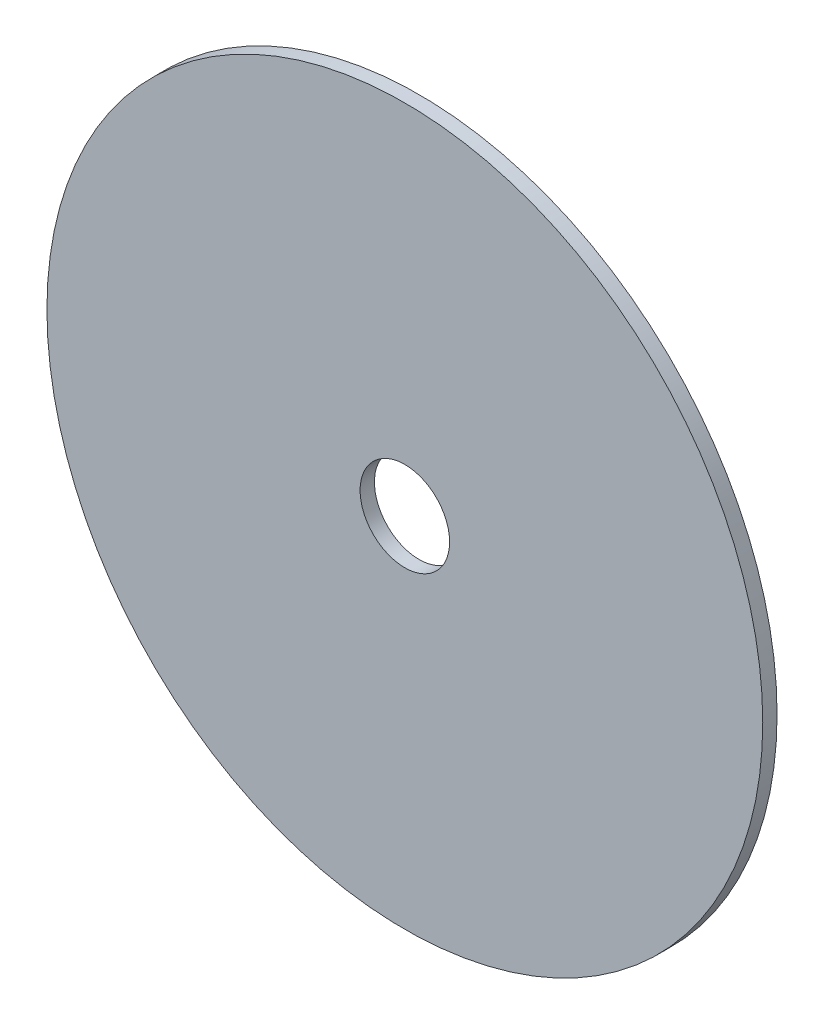
ISO-10303-21;
HEADER;
FILE_DESCRIPTION(('STEP AP214'),'2;1');
FILE_NAME('part.step','',(''),(''),'','','');
FILE_SCHEMA(('AUTOMOTIVE_DESIGN { 1 0 10303 214 1 1 1 1 }'));
ENDSEC;
DATA;
#1=APPLICATION_CONTEXT('core data for automotive mechanical design processes');
#2=APPLICATION_PROTOCOL_DEFINITION('international standard','automotive_design',2000,#1);
#3=PRODUCT_CONTEXT('',#1,'mechanical');
#4=PRODUCT('Part','Part','',(#3));
#5=PRODUCT_RELATED_PRODUCT_CATEGORY('part','',(#4));
#6=PRODUCT_DEFINITION_FORMATION('','',#4);
#7=PRODUCT_DEFINITION_CONTEXT('part definition',#1,'design');
#8=PRODUCT_DEFINITION('design','',#6,#7);
#9=PRODUCT_DEFINITION_SHAPE('','',#8);
#10=(LENGTH_UNIT() NAMED_UNIT(*) SI_UNIT(.MILLI.,.METRE.));
#11=(NAMED_UNIT(*) PLANE_ANGLE_UNIT() SI_UNIT($,.RADIAN.));
#12=(NAMED_UNIT(*) SI_UNIT($,.STERADIAN.) SOLID_ANGLE_UNIT());
#13=UNCERTAINTY_MEASURE_WITH_UNIT(LENGTH_MEASURE(1.E-05),#10,'distance_accuracy_value','');
#14=(GEOMETRIC_REPRESENTATION_CONTEXT(3) GLOBAL_UNCERTAINTY_ASSIGNED_CONTEXT((#13)) GLOBAL_UNIT_ASSIGNED_CONTEXT((#10,
#11,#12)) REPRESENTATION_CONTEXT('',''));
#15=CARTESIAN_POINT('',(0.,0.,0.));
#16=DIRECTION('',(0.,0.,1.));
#17=DIRECTION('',(1.,0.,0.));
#18=AXIS2_PLACEMENT_3D('',#15,#16,#17);
#19=CARTESIAN_POINT('',(0.,0.,1.6));
#20=DIRECTION('',(0.,0.,1.));
#21=DIRECTION('',(1.,0.,0.));
#22=AXIS2_PLACEMENT_3D('',#19,#20,#21);
#23=PLANE('',#22);
#24=CARTESIAN_POINT('',(0.,0.,1.6));
#25=DIRECTION('',(0.,0.,1.));
#26=DIRECTION('',(1.,0.,0.));
#27=AXIS2_PLACEMENT_3D('',#24,#25,#26);
#28=CIRCLE('',#27,40.);
#29=CARTESIAN_POINT('',(40.,0.,1.6));
#30=VERTEX_POINT('',#29);
#31=EDGE_CURVE('E10',#30,#30,#28,.T.);
#32=ORIENTED_EDGE('',*,*,#31,.T.);
#33=EDGE_LOOP('',(#32));
#34=FACE_BOUND('',#33,.T.);
#35=CARTESIAN_POINT('',(0.,0.,1.6));
#36=DIRECTION('',(0.,0.,1.));
#37=DIRECTION('',(1.,0.,0.));
#38=AXIS2_PLACEMENT_3D('',#35,#36,#37);
#39=CIRCLE('',#38,5.);
#40=CARTESIAN_POINT('',(5.,0.,1.6));
#41=VERTEX_POINT('',#40);
#42=EDGE_CURVE('E44',#41,#41,#39,.T.);
#43=ORIENTED_EDGE('',*,*,#42,.F.);
#44=EDGE_LOOP('',(#43));
#45=FACE_BOUND('',#44,.T.);
#46=ADVANCED_FACE('F33',(#34,#45),#23,.T.);
#47=CARTESIAN_POINT('',(0.,0.,0.));
#48=DIRECTION('',(0.,0.,1.));
#49=DIRECTION('',(1.,0.,0.));
#50=AXIS2_PLACEMENT_3D('',#47,#48,#49);
#51=PLANE('',#50);
#52=CARTESIAN_POINT('',(0.,0.,0.));
#53=DIRECTION('',(0.,0.,1.));
#54=DIRECTION('',(1.,0.,0.));
#55=AXIS2_PLACEMENT_3D('',#52,#53,#54);
#56=CIRCLE('',#55,40.);
#57=CARTESIAN_POINT('',(40.,0.,0.));
#58=VERTEX_POINT('',#57);
#59=EDGE_CURVE('E37',#58,#58,#56,.T.);
#60=ORIENTED_EDGE('',*,*,#59,.F.);
#61=EDGE_LOOP('',(#60));
#62=FACE_BOUND('',#61,.T.);
#63=CARTESIAN_POINT('',(0.,0.,0.));
#64=DIRECTION('',(0.,0.,1.));
#65=DIRECTION('',(1.,0.,0.));
#66=AXIS2_PLACEMENT_3D('',#63,#64,#65);
#67=CIRCLE('',#66,5.);
#68=CARTESIAN_POINT('',(5.,0.,0.));
#69=VERTEX_POINT('',#68);
#70=EDGE_CURVE('E46',#69,#69,#67,.T.);
#71=ORIENTED_EDGE('',*,*,#70,.T.);
#72=EDGE_LOOP('',(#71));
#73=FACE_BOUND('',#72,.T.);
#74=ADVANCED_FACE('F56',(#62,#73),#51,.F.);
#75=CARTESIAN_POINT('',(0.,0.,1.6));
#76=DIRECTION('',(0.,0.,-1.));
#77=DIRECTION('',(-1.,0.,0.));
#78=AXIS2_PLACEMENT_3D('',#75,#76,#77);
#79=CYLINDRICAL_SURFACE('',#78,40.);
#80=ORIENTED_EDGE('',*,*,#31,.F.);
#81=EDGE_LOOP('',(#80));
#82=FACE_BOUND('',#81,.T.);
#83=ORIENTED_EDGE('',*,*,#59,.T.);
#84=EDGE_LOOP('',(#83));
#85=FACE_BOUND('',#84,.T.);
#86=ADVANCED_FACE('F35',(#82,#85),#79,.T.);
#87=CARTESIAN_POINT('',(0.,0.,1.6));
#88=DIRECTION('',(0.,0.,-1.));
#89=DIRECTION('',(-1.,0.,0.));
#90=AXIS2_PLACEMENT_3D('',#87,#88,#89);
#91=CYLINDRICAL_SURFACE('',#90,5.);
#92=ORIENTED_EDGE('',*,*,#42,.T.);
#93=EDGE_LOOP('',(#92));
#94=FACE_BOUND('',#93,.T.);
#95=ORIENTED_EDGE('',*,*,#70,.F.);
#96=EDGE_LOOP('',(#95));
#97=FACE_BOUND('',#96,.T.);
#98=ADVANCED_FACE('F52',(#94,#97),#91,.F.);
#99=CLOSED_SHELL('',(#46,#74,#86,#98));
#100=MANIFOLD_SOLID_BREP('B2',#99);
#101=ADVANCED_BREP_SHAPE_REPRESENTATION('',(#18,#100),#14);
#102=SHAPE_DEFINITION_REPRESENTATION(#9,#101);
ENDSEC;
END-ISO-10303-21;
